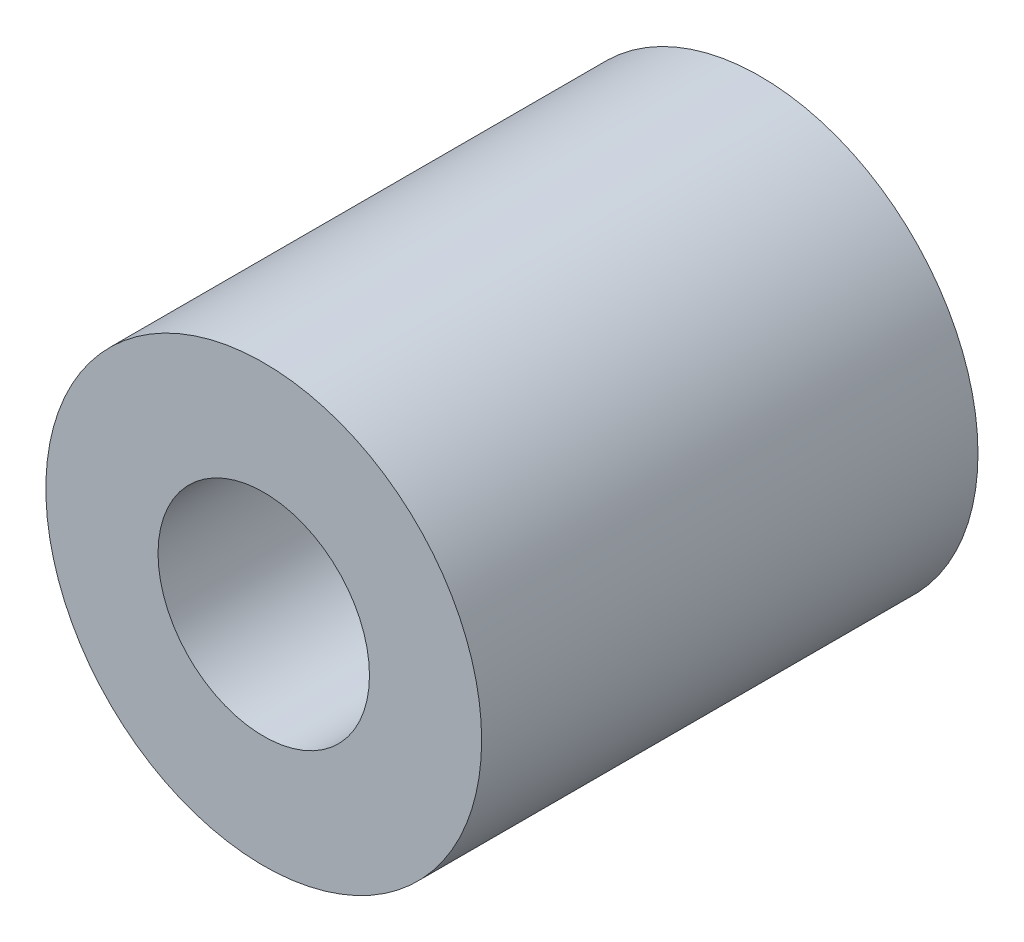
ISO-10303-21;
HEADER;
FILE_DESCRIPTION(('STEP AP214'),'2;1');
FILE_NAME('part.step','',(''),(''),'','','');
FILE_SCHEMA(('AUTOMOTIVE_DESIGN { 1 0 10303 214 1 1 1 1 }'));
ENDSEC;
DATA;
#1=APPLICATION_CONTEXT('core data for automotive mechanical design processes');
#2=APPLICATION_PROTOCOL_DEFINITION('international standard','automotive_design',2000,#1);
#3=PRODUCT_CONTEXT('',#1,'mechanical');
#4=PRODUCT('Part','Part','',(#3));
#5=PRODUCT_RELATED_PRODUCT_CATEGORY('part','',(#4));
#6=PRODUCT_DEFINITION_FORMATION('','',#4);
#7=PRODUCT_DEFINITION_CONTEXT('part definition',#1,'design');
#8=PRODUCT_DEFINITION('design','',#6,#7);
#9=PRODUCT_DEFINITION_SHAPE('','',#8);
#10=(LENGTH_UNIT() NAMED_UNIT(*) SI_UNIT(.MILLI.,.METRE.));
#11=(NAMED_UNIT(*) PLANE_ANGLE_UNIT() SI_UNIT($,.RADIAN.));
#12=(NAMED_UNIT(*) SI_UNIT($,.STERADIAN.) SOLID_ANGLE_UNIT());
#13=UNCERTAINTY_MEASURE_WITH_UNIT(LENGTH_MEASURE(1.E-05),#10,'distance_accuracy_value','');
#14=(GEOMETRIC_REPRESENTATION_CONTEXT(3) GLOBAL_UNCERTAINTY_ASSIGNED_CONTEXT((#13)) GLOBAL_UNIT_ASSIGNED_CONTEXT((#10,
#11,#12)) REPRESENTATION_CONTEXT('',''));
#15=CARTESIAN_POINT('',(0.,0.,0.));
#16=DIRECTION('',(0.,0.,1.));
#17=DIRECTION('',(1.,0.,0.));
#18=AXIS2_PLACEMENT_3D('',#15,#16,#17);
#19=CARTESIAN_POINT('',(0.,0.,6.35));
#20=DIRECTION('',(0.,0.,-1.));
#21=DIRECTION('',(-1.,0.,0.));
#22=AXIS2_PLACEMENT_3D('',#19,#20,#21);
#23=CYLINDRICAL_SURFACE('',#22,2.78765);
#24=CARTESIAN_POINT('',(0.,0.,6.35));
#25=DIRECTION('',(0.,0.,1.));
#26=DIRECTION('',(1.,0.,0.));
#27=AXIS2_PLACEMENT_3D('',#24,#25,#26);
#28=CIRCLE('',#27,2.78765);
#29=CARTESIAN_POINT('',(2.78765,0.,6.35));
#30=VERTEX_POINT('',#29);
#31=EDGE_CURVE('E10',#30,#30,#28,.T.);
#32=ORIENTED_EDGE('',*,*,#31,.F.);
#33=EDGE_LOOP('',(#32));
#34=FACE_BOUND('',#33,.T.);
#35=CARTESIAN_POINT('',(0.,0.,0.));
#36=DIRECTION('',(0.,0.,1.));
#37=DIRECTION('',(1.,0.,0.));
#38=AXIS2_PLACEMENT_3D('',#35,#36,#37);
#39=CIRCLE('',#38,2.78765);
#40=CARTESIAN_POINT('',(2.78765,0.,0.));
#41=VERTEX_POINT('',#40);
#42=EDGE_CURVE('E37',#41,#41,#39,.T.);
#43=ORIENTED_EDGE('',*,*,#42,.T.);
#44=EDGE_LOOP('',(#43));
#45=FACE_BOUND('',#44,.T.);
#46=ADVANCED_FACE('F34',(#34,#45),#23,.T.);
#47=CARTESIAN_POINT('',(0.,0.,6.35));
#48=DIRECTION('',(0.,0.,1.));
#49=DIRECTION('',(1.,0.,0.));
#50=AXIS2_PLACEMENT_3D('',#47,#48,#49);
#51=PLANE('',#50);
#52=CARTESIAN_POINT('',(0.,0.,6.35));
#53=DIRECTION('',(0.,0.,1.));
#54=DIRECTION('',(1.,0.,0.));
#55=AXIS2_PLACEMENT_3D('',#52,#53,#54);
#56=CIRCLE('',#55,1.35255);
#57=CARTESIAN_POINT('',(1.35255,0.,6.35));
#58=VERTEX_POINT('',#57);
#59=EDGE_CURVE('E44',#58,#58,#56,.T.);
#60=ORIENTED_EDGE('',*,*,#59,.F.);
#61=EDGE_LOOP('',(#60));
#62=FACE_BOUND('',#61,.T.);
#63=ORIENTED_EDGE('',*,*,#31,.T.);
#64=EDGE_LOOP('',(#63));
#65=FACE_BOUND('',#64,.T.);
#66=ADVANCED_FACE('F57',(#62,#65),#51,.T.);
#67=CARTESIAN_POINT('',(0.,0.,0.));
#68=DIRECTION('',(0.,0.,1.));
#69=DIRECTION('',(1.,0.,0.));
#70=AXIS2_PLACEMENT_3D('',#67,#68,#69);
#71=PLANE('',#70);
#72=CARTESIAN_POINT('',(0.,0.,0.));
#73=DIRECTION('',(0.,0.,-1.));
#74=DIRECTION('',(-1.,0.,0.));
#75=AXIS2_PLACEMENT_3D('',#72,#73,#74);
#76=CIRCLE('',#75,1.35255);
#77=CARTESIAN_POINT('',(-1.35255,0.,0.));
#78=VERTEX_POINT('',#77);
#79=EDGE_CURVE('E48',#78,#78,#76,.T.);
#80=ORIENTED_EDGE('',*,*,#79,.F.);
#81=EDGE_LOOP('',(#80));
#82=FACE_BOUND('',#81,.T.);
#83=ORIENTED_EDGE('',*,*,#42,.F.);
#84=EDGE_LOOP('',(#83));
#85=FACE_BOUND('',#84,.T.);
#86=ADVANCED_FACE('F54',(#82,#85),#71,.F.);
#87=CARTESIAN_POINT('',(0.,0.,0.));
#88=DIRECTION('',(0.,0.,-1.));
#89=DIRECTION('',(-1.,0.,0.));
#90=AXIS2_PLACEMENT_3D('',#87,#88,#89);
#91=CYLINDRICAL_SURFACE('',#90,1.35255);
#92=ORIENTED_EDGE('',*,*,#59,.T.);
#93=EDGE_LOOP('',(#92));
#94=FACE_BOUND('',#93,.T.);
#95=ORIENTED_EDGE('',*,*,#79,.T.);
#96=EDGE_LOOP('',(#95));
#97=FACE_BOUND('',#96,.T.);
#98=ADVANCED_FACE('F52',(#94,#97),#91,.F.);
#99=CLOSED_SHELL('',(#46,#66,#86,#98));
#100=MANIFOLD_SOLID_BREP('B2',#99);
#101=ADVANCED_BREP_SHAPE_REPRESENTATION('',(#18,#100),#14);
#102=SHAPE_DEFINITION_REPRESENTATION(#9,#101);
ENDSEC;
END-ISO-10303-21;
